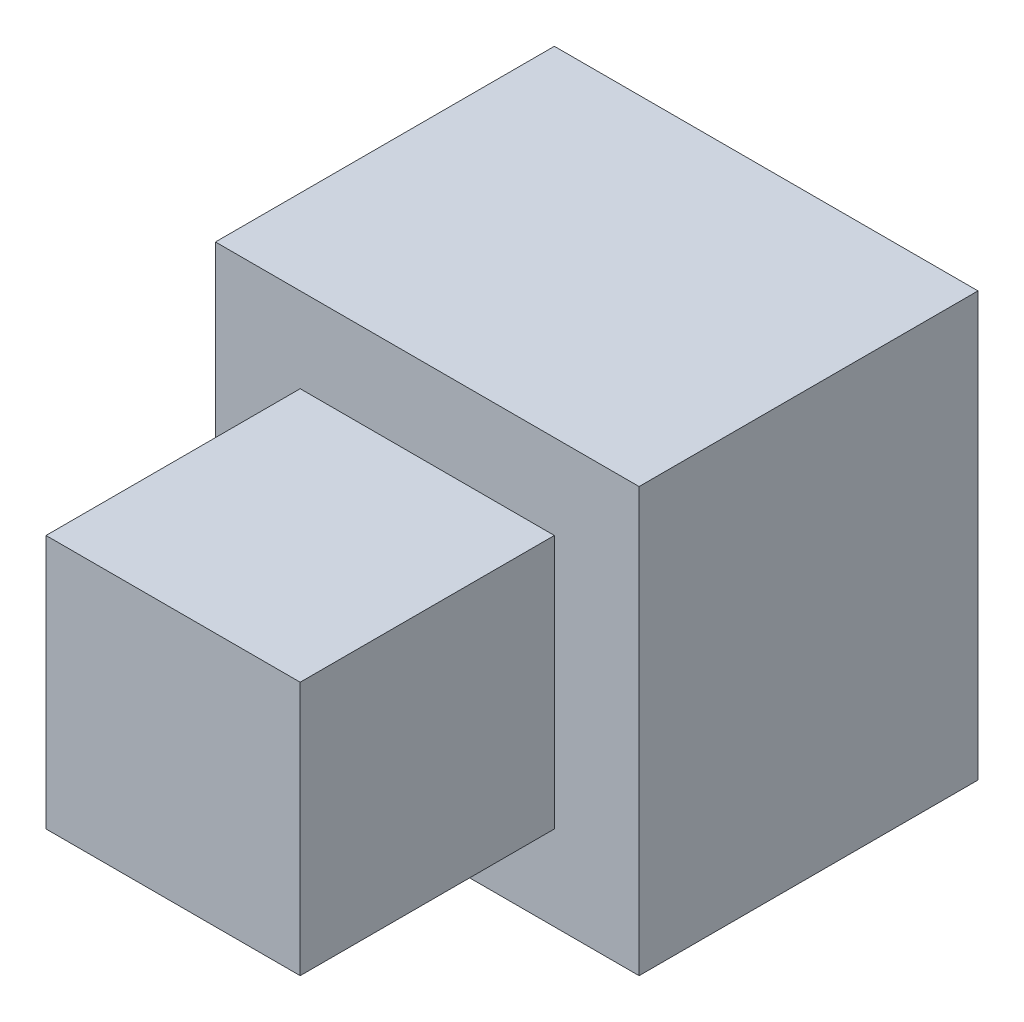
ISO-10303-21;
HEADER;
FILE_DESCRIPTION(('STEP AP214'),'2;1');
FILE_NAME('part.step','',(''),(''),'','','');
FILE_SCHEMA(('AUTOMOTIVE_DESIGN { 1 0 10303 214 1 1 1 1 }'));
ENDSEC;
DATA;
#1=APPLICATION_CONTEXT('core data for automotive mechanical design processes');
#2=APPLICATION_PROTOCOL_DEFINITION('international standard','automotive_design',2000,#1);
#3=PRODUCT_CONTEXT('',#1,'mechanical');
#4=PRODUCT('Part','Part','',(#3));
#5=PRODUCT_RELATED_PRODUCT_CATEGORY('part','',(#4));
#6=PRODUCT_DEFINITION_FORMATION('','',#4);
#7=PRODUCT_DEFINITION_CONTEXT('part definition',#1,'design');
#8=PRODUCT_DEFINITION('design','',#6,#7);
#9=PRODUCT_DEFINITION_SHAPE('','',#8);
#10=(LENGTH_UNIT() NAMED_UNIT(*) SI_UNIT(.MILLI.,.METRE.));
#11=(NAMED_UNIT(*) PLANE_ANGLE_UNIT() SI_UNIT($,.RADIAN.));
#12=(NAMED_UNIT(*) SI_UNIT($,.STERADIAN.) SOLID_ANGLE_UNIT());
#13=UNCERTAINTY_MEASURE_WITH_UNIT(LENGTH_MEASURE(1.E-05),#10,'distance_accuracy_value','');
#14=(GEOMETRIC_REPRESENTATION_CONTEXT(3) GLOBAL_UNCERTAINTY_ASSIGNED_CONTEXT((#13)) GLOBAL_UNIT_ASSIGNED_CONTEXT((#10,
#11,#12)) REPRESENTATION_CONTEXT('',''));
#15=CARTESIAN_POINT('',(0.,0.,0.));
#16=DIRECTION('',(0.,0.,1.));
#17=DIRECTION('',(1.,0.,0.));
#18=AXIS2_PLACEMENT_3D('',#15,#16,#17);
#19=CARTESIAN_POINT('',(0.,0.,40.));
#20=DIRECTION('',(0.,0.,-1.));
#21=DIRECTION('',(-1.,0.,0.));
#22=AXIS2_PLACEMENT_3D('',#19,#20,#21);
#23=PLANE('',#22);
#24=DIRECTION('',(0.,1.,0.));
#25=VECTOR('',#24,1.);
#26=CARTESIAN_POINT('',(25.,-25.,40.));
#27=LINE('',#26,#25);
#28=CARTESIAN_POINT('',(25.,-25.,40.));
#29=VERTEX_POINT('',#28);
#30=CARTESIAN_POINT('',(25.,25.,40.));
#31=VERTEX_POINT('',#30);
#32=EDGE_CURVE('E139',#29,#31,#27,.T.);
#33=ORIENTED_EDGE('',*,*,#32,.T.);
#34=DIRECTION('',(-1.,0.,0.));
#35=VECTOR('',#34,1.);
#36=CARTESIAN_POINT('',(-25.,25.,40.));
#37=LINE('',#36,#35);
#38=CARTESIAN_POINT('',(-25.,25.,40.));
#39=VERTEX_POINT('',#38);
#40=EDGE_CURVE('E143',#31,#39,#37,.T.);
#41=ORIENTED_EDGE('',*,*,#40,.T.);
#42=DIRECTION('',(0.,-1.,0.));
#43=VECTOR('',#42,1.);
#44=CARTESIAN_POINT('',(-25.,-25.,40.));
#45=LINE('',#44,#43);
#46=CARTESIAN_POINT('',(-25.,-25.,40.));
#47=VERTEX_POINT('',#46);
#48=EDGE_CURVE('E147',#39,#47,#45,.T.);
#49=ORIENTED_EDGE('',*,*,#48,.T.);
#50=DIRECTION('',(1.,0.,0.));
#51=VECTOR('',#50,1.);
#52=CARTESIAN_POINT('',(-25.,-25.,40.));
#53=LINE('',#52,#51);
#54=EDGE_CURVE('E150',#47,#29,#53,.T.);
#55=ORIENTED_EDGE('',*,*,#54,.T.);
#56=EDGE_LOOP('',(#33,#41,#49,#55));
#57=FACE_BOUND('',#56,.T.);
#58=DIRECTION('',(0.,1.,0.));
#59=VECTOR('',#58,1.);
#60=CARTESIAN_POINT('',(15.,-15.,40.));
#61=LINE('',#60,#59);
#62=CARTESIAN_POINT('',(15.,-15.,40.));
#63=VERTEX_POINT('',#62);
#64=CARTESIAN_POINT('',(15.,15.,40.));
#65=VERTEX_POINT('',#64);
#66=EDGE_CURVE('E55',#63,#65,#61,.T.);
#67=ORIENTED_EDGE('',*,*,#66,.F.);
#68=DIRECTION('',(1.,0.,0.));
#69=VECTOR('',#68,1.);
#70=CARTESIAN_POINT('',(-15.,-15.,40.));
#71=LINE('',#70,#69);
#72=CARTESIAN_POINT('',(-15.,-15.,40.));
#73=VERTEX_POINT('',#72);
#74=EDGE_CURVE('E59',#73,#63,#71,.T.);
#75=ORIENTED_EDGE('',*,*,#74,.F.);
#76=DIRECTION('',(0.,-1.,0.));
#77=VECTOR('',#76,1.);
#78=CARTESIAN_POINT('',(-15.,-15.,40.));
#79=LINE('',#78,#77);
#80=CARTESIAN_POINT('',(-15.,15.,40.));
#81=VERTEX_POINT('',#80);
#82=EDGE_CURVE('E283',#81,#73,#79,.T.);
#83=ORIENTED_EDGE('',*,*,#82,.F.);
#84=DIRECTION('',(-1.,0.,0.));
#85=VECTOR('',#84,1.);
#86=CARTESIAN_POINT('',(-15.,15.,40.));
#87=LINE('',#86,#85);
#88=EDGE_CURVE('E293',#65,#81,#87,.T.);
#89=ORIENTED_EDGE('',*,*,#88,.F.);
#90=EDGE_LOOP('',(#67,#75,#83,#89));
#91=FACE_BOUND('',#90,.T.);
#92=ADVANCED_FACE('F39',(#57,#91),#23,.F.);
#93=CARTESIAN_POINT('',(25.,-25.,40.));
#94=DIRECTION('',(-1.,0.,0.));
#95=DIRECTION('',(0.,0.,1.));
#96=AXIS2_PLACEMENT_3D('',#93,#94,#95);
#97=PLANE('',#96);
#98=DIRECTION('',(0.,1.,0.));
#99=VECTOR('',#98,1.);
#100=CARTESIAN_POINT('',(25.,-25.,0.));
#101=LINE('',#100,#99);
#102=CARTESIAN_POINT('',(25.,-25.,0.));
#103=VERTEX_POINT('',#102);
#104=CARTESIAN_POINT('',(25.,25.,0.));
#105=VERTEX_POINT('',#104);
#106=EDGE_CURVE('E128',#103,#105,#101,.T.);
#107=ORIENTED_EDGE('',*,*,#106,.T.);
#108=DIRECTION('',(0.,0.,-1.));
#109=VECTOR('',#108,1.);
#110=CARTESIAN_POINT('',(25.,25.,40.));
#111=LINE('',#110,#109);
#112=EDGE_CURVE('E11',#31,#105,#111,.T.);
#113=ORIENTED_EDGE('',*,*,#112,.F.);
#114=ORIENTED_EDGE('',*,*,#32,.F.);
#115=DIRECTION('',(0.,0.,-1.));
#116=VECTOR('',#115,1.);
#117=CARTESIAN_POINT('',(25.,-25.,40.));
#118=LINE('',#117,#116);
#119=EDGE_CURVE('E152',#29,#103,#118,.T.);
#120=ORIENTED_EDGE('',*,*,#119,.T.);
#121=EDGE_LOOP('',(#107,#113,#114,#120));
#122=FACE_BOUND('',#121,.T.);
#123=ADVANCED_FACE('F41',(#122),#97,.F.);
#124=CARTESIAN_POINT('',(-25.,25.,40.));
#125=DIRECTION('',(0.,-1.,0.));
#126=DIRECTION('',(0.,0.,-1.));
#127=AXIS2_PLACEMENT_3D('',#124,#125,#126);
#128=PLANE('',#127);
#129=DIRECTION('',(-1.,0.,0.));
#130=VECTOR('',#129,1.);
#131=CARTESIAN_POINT('',(-25.,25.,0.));
#132=LINE('',#131,#130);
#133=CARTESIAN_POINT('',(-25.,25.,0.));
#134=VERTEX_POINT('',#133);
#135=EDGE_CURVE('E133',#105,#134,#132,.T.);
#136=ORIENTED_EDGE('',*,*,#135,.T.);
#137=DIRECTION('',(0.,0.,-1.));
#138=VECTOR('',#137,1.);
#139=CARTESIAN_POINT('',(-25.,25.,40.));
#140=LINE('',#139,#138);
#141=EDGE_CURVE('E48',#39,#134,#140,.T.);
#142=ORIENTED_EDGE('',*,*,#141,.F.);
#143=ORIENTED_EDGE('',*,*,#40,.F.);
#144=ORIENTED_EDGE('',*,*,#112,.T.);
#145=EDGE_LOOP('',(#136,#142,#143,#144));
#146=FACE_BOUND('',#145,.T.);
#147=ADVANCED_FACE('F188',(#146),#128,.F.);
#148=CARTESIAN_POINT('',(-25.,-25.,40.));
#149=DIRECTION('',(1.,0.,0.));
#150=DIRECTION('',(0.,0.,-1.));
#151=AXIS2_PLACEMENT_3D('',#148,#149,#150);
#152=PLANE('',#151);
#153=DIRECTION('',(0.,-1.,0.));
#154=VECTOR('',#153,1.);
#155=CARTESIAN_POINT('',(-25.,-25.,0.));
#156=LINE('',#155,#154);
#157=CARTESIAN_POINT('',(-25.,-25.,0.));
#158=VERTEX_POINT('',#157);
#159=EDGE_CURVE('E156',#134,#158,#156,.T.);
#160=ORIENTED_EDGE('',*,*,#159,.T.);
#161=DIRECTION('',(0.,0.,-1.));
#162=VECTOR('',#161,1.);
#163=CARTESIAN_POINT('',(-25.,-25.,40.));
#164=LINE('',#163,#162);
#165=EDGE_CURVE('E164',#47,#158,#164,.T.);
#166=ORIENTED_EDGE('',*,*,#165,.F.);
#167=ORIENTED_EDGE('',*,*,#48,.F.);
#168=ORIENTED_EDGE('',*,*,#141,.T.);
#169=EDGE_LOOP('',(#160,#166,#167,#168));
#170=FACE_BOUND('',#169,.T.);
#171=ADVANCED_FACE('F173',(#170),#152,.F.);
#172=CARTESIAN_POINT('',(-25.,-25.,40.));
#173=DIRECTION('',(0.,1.,0.));
#174=DIRECTION('',(0.,0.,1.));
#175=AXIS2_PLACEMENT_3D('',#172,#173,#174);
#176=PLANE('',#175);
#177=DIRECTION('',(1.,0.,0.));
#178=VECTOR('',#177,1.);
#179=CARTESIAN_POINT('',(-25.,-25.,0.));
#180=LINE('',#179,#178);
#181=EDGE_CURVE('E144',#158,#103,#180,.T.);
#182=ORIENTED_EDGE('',*,*,#181,.T.);
#183=ORIENTED_EDGE('',*,*,#119,.F.);
#184=ORIENTED_EDGE('',*,*,#54,.F.);
#185=ORIENTED_EDGE('',*,*,#165,.T.);
#186=EDGE_LOOP('',(#182,#183,#184,#185));
#187=FACE_BOUND('',#186,.T.);
#188=ADVANCED_FACE('F182',(#187),#176,.F.);
#189=CARTESIAN_POINT('',(0.,0.,0.));
#190=DIRECTION('',(0.,0.,-1.));
#191=DIRECTION('',(-1.,0.,0.));
#192=AXIS2_PLACEMENT_3D('',#189,#190,#191);
#193=PLANE('',#192);
#194=ORIENTED_EDGE('',*,*,#106,.F.);
#195=ORIENTED_EDGE('',*,*,#181,.F.);
#196=ORIENTED_EDGE('',*,*,#159,.F.);
#197=ORIENTED_EDGE('',*,*,#135,.F.);
#198=EDGE_LOOP('',(#194,#195,#196,#197));
#199=FACE_BOUND('',#198,.T.);
#200=ADVANCED_FACE('F179',(#199),#193,.T.);
#201=CARTESIAN_POINT('',(15.,-15.,70.));
#202=DIRECTION('',(-1.,0.,0.));
#203=DIRECTION('',(0.,0.,1.));
#204=AXIS2_PLACEMENT_3D('',#201,#202,#203);
#205=PLANE('',#204);
#206=ORIENTED_EDGE('',*,*,#66,.T.);
#207=DIRECTION('',(0.,0.,-1.));
#208=VECTOR('',#207,1.);
#209=CARTESIAN_POINT('',(15.,15.,70.));
#210=LINE('',#209,#208);
#211=CARTESIAN_POINT('',(15.,15.,70.));
#212=VERTEX_POINT('',#211);
#213=EDGE_CURVE('E108',#212,#65,#210,.T.);
#214=ORIENTED_EDGE('',*,*,#213,.F.);
#215=DIRECTION('',(0.,1.,0.));
#216=VECTOR('',#215,1.);
#217=CARTESIAN_POINT('',(15.,-15.,70.));
#218=LINE('',#217,#216);
#219=CARTESIAN_POINT('',(15.,-15.,70.));
#220=VERTEX_POINT('',#219);
#221=EDGE_CURVE('E115',#220,#212,#218,.T.);
#222=ORIENTED_EDGE('',*,*,#221,.F.);
#223=DIRECTION('',(0.,0.,-1.));
#224=VECTOR('',#223,1.);
#225=CARTESIAN_POINT('',(15.,-15.,70.));
#226=LINE('',#225,#224);
#227=EDGE_CURVE('E280',#220,#63,#226,.T.);
#228=ORIENTED_EDGE('',*,*,#227,.T.);
#229=EDGE_LOOP('',(#206,#214,#222,#228));
#230=FACE_BOUND('',#229,.T.);
#231=ADVANCED_FACE('F126',(#230),#205,.F.);
#232=CARTESIAN_POINT('',(-15.,15.,70.));
#233=DIRECTION('',(0.,-1.,0.));
#234=DIRECTION('',(1.,0.,0.));
#235=AXIS2_PLACEMENT_3D('',#232,#233,#234);
#236=PLANE('',#235);
#237=ORIENTED_EDGE('',*,*,#88,.T.);
#238=DIRECTION('',(0.,0.,-1.));
#239=VECTOR('',#238,1.);
#240=CARTESIAN_POINT('',(-15.,15.,70.));
#241=LINE('',#240,#239);
#242=CARTESIAN_POINT('',(-15.,15.,70.));
#243=VERTEX_POINT('',#242);
#244=EDGE_CURVE('E110',#243,#81,#241,.T.);
#245=ORIENTED_EDGE('',*,*,#244,.F.);
#246=DIRECTION('',(-1.,0.,0.));
#247=VECTOR('',#246,1.);
#248=CARTESIAN_POINT('',(-15.,15.,70.));
#249=LINE('',#248,#247);
#250=EDGE_CURVE('E103',#212,#243,#249,.T.);
#251=ORIENTED_EDGE('',*,*,#250,.F.);
#252=ORIENTED_EDGE('',*,*,#213,.T.);
#253=EDGE_LOOP('',(#237,#245,#251,#252));
#254=FACE_BOUND('',#253,.T.);
#255=ADVANCED_FACE('F106',(#254),#236,.F.);
#256=CARTESIAN_POINT('',(-15.,-15.,70.));
#257=DIRECTION('',(1.,0.,0.));
#258=DIRECTION('',(0.,0.,-1.));
#259=AXIS2_PLACEMENT_3D('',#256,#257,#258);
#260=PLANE('',#259);
#261=ORIENTED_EDGE('',*,*,#82,.T.);
#262=DIRECTION('',(0.,0.,-1.));
#263=VECTOR('',#262,1.);
#264=CARTESIAN_POINT('',(-15.,-15.,70.));
#265=LINE('',#264,#263);
#266=CARTESIAN_POINT('',(-15.,-15.,70.));
#267=VERTEX_POINT('',#266);
#268=EDGE_CURVE('E135',#267,#73,#265,.T.);
#269=ORIENTED_EDGE('',*,*,#268,.F.);
#270=DIRECTION('',(0.,-1.,0.));
#271=VECTOR('',#270,1.);
#272=CARTESIAN_POINT('',(-15.,-15.,70.));
#273=LINE('',#272,#271);
#274=EDGE_CURVE('E114',#243,#267,#273,.T.);
#275=ORIENTED_EDGE('',*,*,#274,.F.);
#276=ORIENTED_EDGE('',*,*,#244,.T.);
#277=EDGE_LOOP('',(#261,#269,#275,#276));
#278=FACE_BOUND('',#277,.T.);
#279=ADVANCED_FACE('F224',(#278),#260,.F.);
#280=CARTESIAN_POINT('',(-15.,-15.,70.));
#281=DIRECTION('',(0.,1.,0.));
#282=DIRECTION('',(-1.,0.,0.));
#283=AXIS2_PLACEMENT_3D('',#280,#281,#282);
#284=PLANE('',#283);
#285=ORIENTED_EDGE('',*,*,#74,.T.);
#286=ORIENTED_EDGE('',*,*,#227,.F.);
#287=DIRECTION('',(1.,0.,0.));
#288=VECTOR('',#287,1.);
#289=CARTESIAN_POINT('',(-15.,-15.,70.));
#290=LINE('',#289,#288);
#291=EDGE_CURVE('E120',#267,#220,#290,.T.);
#292=ORIENTED_EDGE('',*,*,#291,.F.);
#293=ORIENTED_EDGE('',*,*,#268,.T.);
#294=EDGE_LOOP('',(#285,#286,#292,#293));
#295=FACE_BOUND('',#294,.T.);
#296=ADVANCED_FACE('F230',(#295),#284,.F.);
#297=CARTESIAN_POINT('',(0.,0.,70.));
#298=DIRECTION('',(0.,0.,-1.));
#299=DIRECTION('',(-1.,0.,0.));
#300=AXIS2_PLACEMENT_3D('',#297,#298,#299);
#301=PLANE('',#300);
#302=ORIENTED_EDGE('',*,*,#221,.T.);
#303=ORIENTED_EDGE('',*,*,#250,.T.);
#304=ORIENTED_EDGE('',*,*,#274,.T.);
#305=ORIENTED_EDGE('',*,*,#291,.T.);
#306=EDGE_LOOP('',(#302,#303,#304,#305));
#307=FACE_BOUND('',#306,.T.);
#308=ADVANCED_FACE('F118',(#307),#301,.F.);
#309=CLOSED_SHELL('',(#92,#123,#147,#171,#188,#200,#231,#255,#279,#296,#308));
#310=MANIFOLD_SOLID_BREP('B2',#309);
#311=ADVANCED_BREP_SHAPE_REPRESENTATION('',(#18,#310),#14);
#312=SHAPE_DEFINITION_REPRESENTATION(#9,#311);
ENDSEC;
END-ISO-10303-21;
